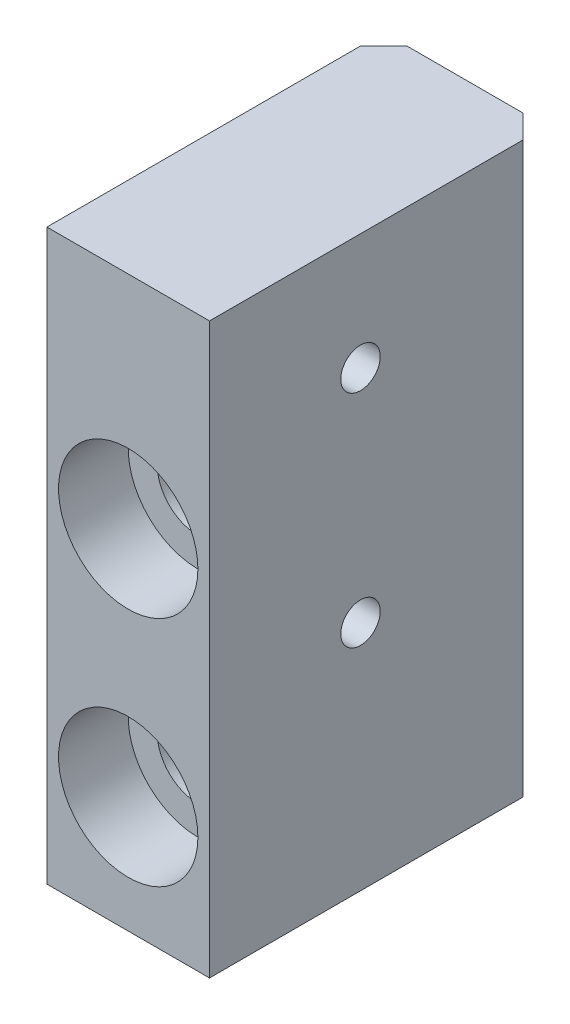
ISO-10303-21;
HEADER;
FILE_DESCRIPTION(('STEP AP214'),'2;1');
FILE_NAME('part.step','',(''),(''),'','','');
FILE_SCHEMA(('AUTOMOTIVE_DESIGN { 1 0 10303 214 1 1 1 1 }'));
ENDSEC;
DATA;
#1=APPLICATION_CONTEXT('core data for automotive mechanical design processes');
#2=APPLICATION_PROTOCOL_DEFINITION('international standard','automotive_design',2000,#1);
#3=PRODUCT_CONTEXT('',#1,'mechanical');
#4=PRODUCT('Part','Part','',(#3));
#5=PRODUCT_RELATED_PRODUCT_CATEGORY('part','',(#4));
#6=PRODUCT_DEFINITION_FORMATION('','',#4);
#7=PRODUCT_DEFINITION_CONTEXT('part definition',#1,'design');
#8=PRODUCT_DEFINITION('design','',#6,#7);
#9=PRODUCT_DEFINITION_SHAPE('','',#8);
#10=(LENGTH_UNIT() NAMED_UNIT(*) SI_UNIT(.MILLI.,.METRE.));
#11=(NAMED_UNIT(*) PLANE_ANGLE_UNIT() SI_UNIT($,.RADIAN.));
#12=(NAMED_UNIT(*) SI_UNIT($,.STERADIAN.) SOLID_ANGLE_UNIT());
#13=UNCERTAINTY_MEASURE_WITH_UNIT(LENGTH_MEASURE(1.E-05),#10,'distance_accuracy_value','');
#14=(GEOMETRIC_REPRESENTATION_CONTEXT(3) GLOBAL_UNCERTAINTY_ASSIGNED_CONTEXT((#13)) GLOBAL_UNIT_ASSIGNED_CONTEXT((#10,
#11,#12)) REPRESENTATION_CONTEXT('',''));
#15=CARTESIAN_POINT('',(0.,0.,0.));
#16=DIRECTION('',(0.,0.,1.));
#17=DIRECTION('',(1.,0.,0.));
#18=AXIS2_PLACEMENT_3D('',#15,#16,#17);
#19=CARTESIAN_POINT('',(3.5,-9.75,-8.));
#20=DIRECTION('',(0.,0.,1.));
#21=DIRECTION('',(1.,0.,0.));
#22=AXIS2_PLACEMENT_3D('',#19,#20,#21);
#23=CYLINDRICAL_SURFACE('',#22,1.75);
#24=CARTESIAN_POINT('',(3.5,-9.75,-8.));
#25=DIRECTION('',(0.,0.,1.));
#26=DIRECTION('',(1.,0.,0.));
#27=AXIS2_PLACEMENT_3D('',#24,#25,#26);
#28=CIRCLE('',#27,1.75);
#29=CARTESIAN_POINT('',(5.25,-9.75,-8.));
#30=VERTEX_POINT('',#29);
#31=EDGE_CURVE('E133',#30,#30,#28,.T.);
#32=ORIENTED_EDGE('',*,*,#31,.F.);
#33=EDGE_LOOP('',(#32));
#34=FACE_BOUND('',#33,.T.);
#35=CARTESIAN_POINT('',(3.5,-9.75,3.5));
#36=DIRECTION('',(0.,0.,1.));
#37=DIRECTION('',(1.,0.,0.));
#38=AXIS2_PLACEMENT_3D('',#35,#36,#37);
#39=CIRCLE('',#38,1.75);
#40=CARTESIAN_POINT('',(5.25,-9.75,3.5));
#41=VERTEX_POINT('',#40);
#42=EDGE_CURVE('E38',#41,#41,#39,.F.);
#43=ORIENTED_EDGE('',*,*,#42,.F.);
#44=EDGE_LOOP('',(#43));
#45=FACE_BOUND('',#44,.T.);
#46=ADVANCED_FACE('F34',(#34,#45),#23,.F.);
#47=CARTESIAN_POINT('',(3.5,0.25,-8.));
#48=DIRECTION('',(0.,0.,1.));
#49=DIRECTION('',(1.,0.,0.));
#50=AXIS2_PLACEMENT_3D('',#47,#48,#49);
#51=CYLINDRICAL_SURFACE('',#50,1.75);
#52=CARTESIAN_POINT('',(3.5,0.25,-8.));
#53=DIRECTION('',(0.,0.,1.));
#54=DIRECTION('',(1.,0.,0.));
#55=AXIS2_PLACEMENT_3D('',#52,#53,#54);
#56=CIRCLE('',#55,1.75);
#57=CARTESIAN_POINT('',(5.25,0.25,-8.));
#58=VERTEX_POINT('',#57);
#59=EDGE_CURVE('E138',#58,#58,#56,.T.);
#60=ORIENTED_EDGE('',*,*,#59,.F.);
#61=EDGE_LOOP('',(#60));
#62=FACE_BOUND('',#61,.T.);
#63=CARTESIAN_POINT('',(3.5,0.25,3.5));
#64=DIRECTION('',(0.,0.,1.));
#65=DIRECTION('',(1.,0.,0.));
#66=AXIS2_PLACEMENT_3D('',#63,#64,#65);
#67=CIRCLE('',#66,1.75);
#68=CARTESIAN_POINT('',(5.25,0.25,3.5));
#69=VERTEX_POINT('',#68);
#70=EDGE_CURVE('E131',#69,#69,#67,.F.);
#71=ORIENTED_EDGE('',*,*,#70,.F.);
#72=EDGE_LOOP('',(#71));
#73=FACE_BOUND('',#72,.T.);
#74=ADVANCED_FACE('F194',(#62,#73),#51,.F.);
#75=CARTESIAN_POINT('',(7.,0.,0.));
#76=DIRECTION('',(1.,0.,0.));
#77=DIRECTION('',(0.,0.,-1.));
#78=AXIS2_PLACEMENT_3D('',#75,#76,#77);
#79=PLANE('',#78);
#80=CARTESIAN_POINT('',(7.,4.75,0.));
#81=DIRECTION('',(1.,0.,0.));
#82=DIRECTION('',(0.,0.,-1.));
#83=AXIS2_PLACEMENT_3D('',#80,#81,#82);
#84=CIRCLE('',#83,0.85);
#85=CARTESIAN_POINT('',(7.,4.75,-0.850000000000002));
#86=VERTEX_POINT('',#85);
#87=EDGE_CURVE('E160',#86,#86,#84,.T.);
#88=ORIENTED_EDGE('',*,*,#87,.F.);
#89=EDGE_LOOP('',(#88));
#90=FACE_BOUND('',#89,.T.);
#91=DIRECTION('',(0.,0.,-1.));
#92=VECTOR('',#91,1.);
#93=CARTESIAN_POINT('',(7.,-14.75,6.5));
#94=LINE('',#93,#92);
#95=CARTESIAN_POINT('',(7.,-14.75,6.5));
#96=VERTEX_POINT('',#95);
#97=CARTESIAN_POINT('',(7.,-14.75,-7.));
#98=VERTEX_POINT('',#97);
#99=EDGE_CURVE('E88',#96,#98,#94,.T.);
#100=ORIENTED_EDGE('',*,*,#99,.T.);
#101=DIRECTION('',(0.,1.,0.));
#102=VECTOR('',#101,1.);
#103=CARTESIAN_POINT('',(7.,9.75,-7.));
#104=LINE('',#103,#102);
#105=CARTESIAN_POINT('',(7.,9.75,-7.));
#106=VERTEX_POINT('',#105);
#107=EDGE_CURVE('E113',#98,#106,#104,.T.);
#108=ORIENTED_EDGE('',*,*,#107,.T.);
#109=DIRECTION('',(0.,0.,1.));
#110=VECTOR('',#109,1.);
#111=CARTESIAN_POINT('',(7.,9.75,6.5));
#112=LINE('',#111,#110);
#113=CARTESIAN_POINT('',(7.,9.75,6.5));
#114=VERTEX_POINT('',#113);
#115=EDGE_CURVE('E98',#106,#114,#112,.T.);
#116=ORIENTED_EDGE('',*,*,#115,.T.);
#117=DIRECTION('',(0.,-1.,0.));
#118=VECTOR('',#117,1.);
#119=CARTESIAN_POINT('',(7.,9.75,6.5));
#120=LINE('',#119,#118);
#121=EDGE_CURVE('E99',#114,#96,#120,.T.);
#122=ORIENTED_EDGE('',*,*,#121,.T.);
#123=EDGE_LOOP('',(#100,#108,#116,#122));
#124=FACE_BOUND('',#123,.T.);
#125=CARTESIAN_POINT('',(7.,-4.75,0.));
#126=DIRECTION('',(1.,0.,0.));
#127=DIRECTION('',(0.,0.,-1.));
#128=AXIS2_PLACEMENT_3D('',#125,#126,#127);
#129=CIRCLE('',#128,0.85);
#130=CARTESIAN_POINT('',(7.,-4.75,-0.85));
#131=VERTEX_POINT('',#130);
#132=EDGE_CURVE('E154',#131,#131,#129,.T.);
#133=ORIENTED_EDGE('',*,*,#132,.F.);
#134=EDGE_LOOP('',(#133));
#135=FACE_BOUND('',#134,.T.);
#136=ADVANCED_FACE('F102',(#90,#124,#135),#79,.T.);
#137=CARTESIAN_POINT('',(0.,0.,0.));
#138=DIRECTION('',(1.,0.,0.));
#139=DIRECTION('',(0.,0.,-1.));
#140=AXIS2_PLACEMENT_3D('',#137,#138,#139);
#141=PLANE('',#140);
#142=CARTESIAN_POINT('',(0.,4.75,0.));
#143=DIRECTION('',(1.,0.,0.));
#144=DIRECTION('',(0.,0.,-1.));
#145=AXIS2_PLACEMENT_3D('',#142,#143,#144);
#146=CIRCLE('',#145,0.85);
#147=CARTESIAN_POINT('',(0.,4.75,-0.850000000000002));
#148=VERTEX_POINT('',#147);
#149=EDGE_CURVE('E157',#148,#148,#146,.T.);
#150=ORIENTED_EDGE('',*,*,#149,.T.);
#151=EDGE_LOOP('',(#150));
#152=FACE_BOUND('',#151,.T.);
#153=DIRECTION('',(0.,0.,1.));
#154=VECTOR('',#153,1.);
#155=CARTESIAN_POINT('',(0.,9.75,6.5));
#156=LINE('',#155,#154);
#157=CARTESIAN_POINT('',(0.,9.75,-6.99999999999999));
#158=VERTEX_POINT('',#157);
#159=CARTESIAN_POINT('',(0.,9.75,6.5));
#160=VERTEX_POINT('',#159);
#161=EDGE_CURVE('E108',#158,#160,#156,.T.);
#162=ORIENTED_EDGE('',*,*,#161,.F.);
#163=DIRECTION('',(0.,-1.,0.));
#164=VECTOR('',#163,1.);
#165=CARTESIAN_POINT('',(0.,0.,-7.));
#166=LINE('',#165,#164);
#167=CARTESIAN_POINT('',(0.,-14.75,-7.));
#168=VERTEX_POINT('',#167);
#169=EDGE_CURVE('E11',#158,#168,#166,.T.);
#170=ORIENTED_EDGE('',*,*,#169,.T.);
#171=DIRECTION('',(0.,0.,-1.));
#172=VECTOR('',#171,1.);
#173=CARTESIAN_POINT('',(0.,-14.75,6.5));
#174=LINE('',#173,#172);
#175=CARTESIAN_POINT('',(0.,-14.75,6.5));
#176=VERTEX_POINT('',#175);
#177=EDGE_CURVE('E168',#176,#168,#174,.T.);
#178=ORIENTED_EDGE('',*,*,#177,.F.);
#179=DIRECTION('',(0.,-1.,0.));
#180=VECTOR('',#179,1.);
#181=CARTESIAN_POINT('',(0.,9.75,6.5));
#182=LINE('',#181,#180);
#183=EDGE_CURVE('E112',#160,#176,#182,.T.);
#184=ORIENTED_EDGE('',*,*,#183,.F.);
#185=EDGE_LOOP('',(#162,#170,#178,#184));
#186=FACE_BOUND('',#185,.T.);
#187=CARTESIAN_POINT('',(0.,-4.75,0.));
#188=DIRECTION('',(1.,0.,0.));
#189=DIRECTION('',(0.,0.,-1.));
#190=AXIS2_PLACEMENT_3D('',#187,#188,#189);
#191=CIRCLE('',#190,0.85);
#192=CARTESIAN_POINT('',(0.,-4.75,-0.85));
#193=VERTEX_POINT('',#192);
#194=EDGE_CURVE('E153',#193,#193,#191,.T.);
#195=ORIENTED_EDGE('',*,*,#194,.T.);
#196=EDGE_LOOP('',(#195));
#197=FACE_BOUND('',#196,.T.);
#198=ADVANCED_FACE('F181',(#152,#186,#197),#141,.F.);
#199=CARTESIAN_POINT('',(7.,9.75,6.5));
#200=DIRECTION('',(0.,0.,-1.));
#201=DIRECTION('',(0.,1.,0.));
#202=AXIS2_PLACEMENT_3D('',#199,#200,#201);
#203=PLANE('',#202);
#204=CARTESIAN_POINT('',(3.5,-9.75,6.5));
#205=DIRECTION('',(0.,0.,1.));
#206=DIRECTION('',(1.,0.,0.));
#207=AXIS2_PLACEMENT_3D('',#204,#205,#206);
#208=CIRCLE('',#207,3.);
#209=CARTESIAN_POINT('',(6.5,-9.75,6.5));
#210=VERTEX_POINT('',#209);
#211=EDGE_CURVE('E148',#210,#210,#208,.T.);
#212=ORIENTED_EDGE('',*,*,#211,.F.);
#213=EDGE_LOOP('',(#212));
#214=FACE_BOUND('',#213,.T.);
#215=CARTESIAN_POINT('',(3.5,0.25,6.5));
#216=DIRECTION('',(0.,0.,1.));
#217=DIRECTION('',(1.,0.,0.));
#218=AXIS2_PLACEMENT_3D('',#215,#216,#217);
#219=CIRCLE('',#218,3.);
#220=CARTESIAN_POINT('',(6.5,0.25,6.5));
#221=VERTEX_POINT('',#220);
#222=EDGE_CURVE('E141',#221,#221,#219,.T.);
#223=ORIENTED_EDGE('',*,*,#222,.F.);
#224=EDGE_LOOP('',(#223));
#225=FACE_BOUND('',#224,.T.);
#226=ORIENTED_EDGE('',*,*,#183,.T.);
#227=DIRECTION('',(-1.,0.,0.));
#228=VECTOR('',#227,1.);
#229=CARTESIAN_POINT('',(7.,-14.75,6.5));
#230=LINE('',#229,#228);
#231=EDGE_CURVE('E92',#96,#176,#230,.T.);
#232=ORIENTED_EDGE('',*,*,#231,.F.);
#233=ORIENTED_EDGE('',*,*,#121,.F.);
#234=DIRECTION('',(-1.,0.,0.));
#235=VECTOR('',#234,1.);
#236=CARTESIAN_POINT('',(7.,9.75,6.5));
#237=LINE('',#236,#235);
#238=EDGE_CURVE('E166',#114,#160,#237,.T.);
#239=ORIENTED_EDGE('',*,*,#238,.T.);
#240=EDGE_LOOP('',(#226,#232,#233,#239));
#241=FACE_BOUND('',#240,.T.);
#242=ADVANCED_FACE('F110',(#214,#225,#241),#203,.F.);
#243=CARTESIAN_POINT('',(7.,-14.75,6.5));
#244=DIRECTION('',(0.,1.,0.));
#245=DIRECTION('',(0.,0.,1.));
#246=AXIS2_PLACEMENT_3D('',#243,#244,#245);
#247=PLANE('',#246);
#248=DIRECTION('',(-1.,0.,0.));
#249=VECTOR('',#248,1.);
#250=CARTESIAN_POINT('',(7.,-14.75,-8.));
#251=LINE('',#250,#249);
#252=CARTESIAN_POINT('',(6.,-14.75,-8.));
#253=VERTEX_POINT('',#252);
#254=CARTESIAN_POINT('',(1.,-14.75,-8.));
#255=VERTEX_POINT('',#254);
#256=EDGE_CURVE('E114',#253,#255,#251,.T.);
#257=ORIENTED_EDGE('',*,*,#256,.F.);
#258=DIRECTION('',(0.707106781186549,0.,0.707106781186546));
#259=VECTOR('',#258,1.);
#260=CARTESIAN_POINT('',(7.,-14.75,-7.));
#261=LINE('',#260,#259);
#262=EDGE_CURVE('E43',#253,#98,#261,.T.);
#263=ORIENTED_EDGE('',*,*,#262,.T.);
#264=ORIENTED_EDGE('',*,*,#99,.F.);
#265=ORIENTED_EDGE('',*,*,#231,.T.);
#266=ORIENTED_EDGE('',*,*,#177,.T.);
#267=DIRECTION('',(-0.707106781186546,0.,0.707106781186549));
#268=VECTOR('',#267,1.);
#269=CARTESIAN_POINT('',(1.,-14.75,-8.));
#270=LINE('',#269,#268);
#271=EDGE_CURVE('E56',#168,#255,#270,.F.);
#272=ORIENTED_EDGE('',*,*,#271,.T.);
#273=EDGE_LOOP('',(#257,#263,#264,#265,#266,#272));
#274=FACE_BOUND('',#273,.T.);
#275=ADVANCED_FACE('F90',(#274),#247,.F.);
#276=CARTESIAN_POINT('',(7.,9.75,-8.));
#277=DIRECTION('',(0.,0.,1.));
#278=DIRECTION('',(0.,-1.,0.));
#279=AXIS2_PLACEMENT_3D('',#276,#277,#278);
#280=PLANE('',#279);
#281=ORIENTED_EDGE('',*,*,#31,.T.);
#282=EDGE_LOOP('',(#281));
#283=FACE_BOUND('',#282,.T.);
#284=ORIENTED_EDGE('',*,*,#59,.T.);
#285=EDGE_LOOP('',(#284));
#286=FACE_BOUND('',#285,.T.);
#287=DIRECTION('',(-1.,0.,0.));
#288=VECTOR('',#287,1.);
#289=CARTESIAN_POINT('',(7.,9.75,-8.));
#290=LINE('',#289,#288);
#291=CARTESIAN_POINT('',(6.,9.75,-8.));
#292=VERTEX_POINT('',#291);
#293=CARTESIAN_POINT('',(1.,9.75,-8.));
#294=VERTEX_POINT('',#293);
#295=EDGE_CURVE('E118',#292,#294,#290,.T.);
#296=ORIENTED_EDGE('',*,*,#295,.F.);
#297=DIRECTION('',(0.,-1.,0.));
#298=VECTOR('',#297,1.);
#299=CARTESIAN_POINT('',(6.,-14.75,-8.));
#300=LINE('',#299,#298);
#301=EDGE_CURVE('E128',#292,#253,#300,.T.);
#302=ORIENTED_EDGE('',*,*,#301,.T.);
#303=ORIENTED_EDGE('',*,*,#256,.T.);
#304=DIRECTION('',(0.,1.,0.));
#305=VECTOR('',#304,1.);
#306=CARTESIAN_POINT('',(1.,9.75,-8.));
#307=LINE('',#306,#305);
#308=EDGE_CURVE('E125',#255,#294,#307,.T.);
#309=ORIENTED_EDGE('',*,*,#308,.T.);
#310=EDGE_LOOP('',(#296,#302,#303,#309));
#311=FACE_BOUND('',#310,.T.);
#312=ADVANCED_FACE('F177',(#283,#286,#311),#280,.F.);
#313=CARTESIAN_POINT('',(7.,9.75,6.5));
#314=DIRECTION('',(0.,-1.,0.));
#315=DIRECTION('',(0.,0.,-1.));
#316=AXIS2_PLACEMENT_3D('',#313,#314,#315);
#317=PLANE('',#316);
#318=ORIENTED_EDGE('',*,*,#115,.F.);
#319=DIRECTION('',(-0.707106781186549,0.,-0.707106781186546));
#320=VECTOR('',#319,1.);
#321=CARTESIAN_POINT('',(7.,9.75,-7.));
#322=LINE('',#321,#320);
#323=EDGE_CURVE('E123',#106,#292,#322,.T.);
#324=ORIENTED_EDGE('',*,*,#323,.T.);
#325=ORIENTED_EDGE('',*,*,#295,.T.);
#326=DIRECTION('',(0.707106781186546,0.,-0.707106781186549));
#327=VECTOR('',#326,1.);
#328=CARTESIAN_POINT('',(1.,9.75,-8.));
#329=LINE('',#328,#327);
#330=EDGE_CURVE('E116',#294,#158,#329,.F.);
#331=ORIENTED_EDGE('',*,*,#330,.T.);
#332=ORIENTED_EDGE('',*,*,#161,.T.);
#333=ORIENTED_EDGE('',*,*,#238,.F.);
#334=EDGE_LOOP('',(#318,#324,#325,#331,#332,#333));
#335=FACE_BOUND('',#334,.T.);
#336=ADVANCED_FACE('F174',(#335),#317,.F.);
#337=CARTESIAN_POINT('',(7.,4.75,0.));
#338=DIRECTION('',(-1.,0.,0.));
#339=DIRECTION('',(0.,0.,1.));
#340=AXIS2_PLACEMENT_3D('',#337,#338,#339);
#341=CYLINDRICAL_SURFACE('',#340,0.85);
#342=ORIENTED_EDGE('',*,*,#87,.T.);
#343=EDGE_LOOP('',(#342));
#344=FACE_BOUND('',#343,.T.);
#345=ORIENTED_EDGE('',*,*,#149,.F.);
#346=EDGE_LOOP('',(#345));
#347=FACE_BOUND('',#346,.T.);
#348=ADVANCED_FACE('F208',(#344,#347),#341,.F.);
#349=CARTESIAN_POINT('',(7.,-4.75,0.));
#350=DIRECTION('',(-1.,0.,0.));
#351=DIRECTION('',(0.,0.,1.));
#352=AXIS2_PLACEMENT_3D('',#349,#350,#351);
#353=CYLINDRICAL_SURFACE('',#352,0.85);
#354=ORIENTED_EDGE('',*,*,#132,.T.);
#355=EDGE_LOOP('',(#354));
#356=FACE_BOUND('',#355,.T.);
#357=ORIENTED_EDGE('',*,*,#194,.F.);
#358=EDGE_LOOP('',(#357));
#359=FACE_BOUND('',#358,.T.);
#360=ADVANCED_FACE('F192',(#356,#359),#353,.F.);
#361=CARTESIAN_POINT('',(7.,0.,-7.));
#362=DIRECTION('',(0.707106781186546,0.,-0.707106781186549));
#363=DIRECTION('',(0.,-1.,0.));
#364=AXIS2_PLACEMENT_3D('',#361,#362,#363);
#365=PLANE('',#364);
#366=ORIENTED_EDGE('',*,*,#262,.F.);
#367=ORIENTED_EDGE('',*,*,#301,.F.);
#368=ORIENTED_EDGE('',*,*,#323,.F.);
#369=ORIENTED_EDGE('',*,*,#107,.F.);
#370=EDGE_LOOP('',(#366,#367,#368,#369));
#371=FACE_BOUND('',#370,.T.);
#372=ADVANCED_FACE('F180',(#371),#365,.T.);
#373=CARTESIAN_POINT('',(1.,9.75,-8.));
#374=DIRECTION('',(0.707106781186549,0.,0.707106781186546));
#375=DIRECTION('',(0.,1.,0.));
#376=AXIS2_PLACEMENT_3D('',#373,#374,#375);
#377=PLANE('',#376);
#378=ORIENTED_EDGE('',*,*,#271,.F.);
#379=ORIENTED_EDGE('',*,*,#169,.F.);
#380=ORIENTED_EDGE('',*,*,#330,.F.);
#381=ORIENTED_EDGE('',*,*,#308,.F.);
#382=EDGE_LOOP('',(#378,#379,#380,#381));
#383=FACE_BOUND('',#382,.T.);
#384=ADVANCED_FACE('F36',(#383),#377,.F.);
#385=CARTESIAN_POINT('',(3.5,0.25,3.5));
#386=DIRECTION('',(0.,0.,1.));
#387=DIRECTION('',(1.,0.,0.));
#388=AXIS2_PLACEMENT_3D('',#385,#386,#387);
#389=PLANE('',#388);
#390=CARTESIAN_POINT('',(3.5,0.25,3.5));
#391=DIRECTION('',(0.,0.,1.));
#392=DIRECTION('',(1.,0.,0.));
#393=AXIS2_PLACEMENT_3D('',#390,#391,#392);
#394=CIRCLE('',#393,3.);
#395=CARTESIAN_POINT('',(6.5,0.25,3.5));
#396=VERTEX_POINT('',#395);
#397=EDGE_CURVE('E134',#396,#396,#394,.T.);
#398=ORIENTED_EDGE('',*,*,#397,.T.);
#399=EDGE_LOOP('',(#398));
#400=FACE_BOUND('',#399,.T.);
#401=ORIENTED_EDGE('',*,*,#70,.T.);
#402=EDGE_LOOP('',(#401));
#403=FACE_BOUND('',#402,.T.);
#404=ADVANCED_FACE('F185',(#400,#403),#389,.T.);
#405=CARTESIAN_POINT('',(3.5,0.25,3.5));
#406=DIRECTION('',(0.,0.,1.));
#407=DIRECTION('',(1.,0.,0.));
#408=AXIS2_PLACEMENT_3D('',#405,#406,#407);
#409=CYLINDRICAL_SURFACE('',#408,3.);
#410=ORIENTED_EDGE('',*,*,#397,.F.);
#411=EDGE_LOOP('',(#410));
#412=FACE_BOUND('',#411,.T.);
#413=ORIENTED_EDGE('',*,*,#222,.T.);
#414=EDGE_LOOP('',(#413));
#415=FACE_BOUND('',#414,.T.);
#416=ADVANCED_FACE('F190',(#412,#415),#409,.F.);
#417=CARTESIAN_POINT('',(3.5,-9.75,3.5));
#418=DIRECTION('',(0.,0.,1.));
#419=DIRECTION('',(1.,0.,0.));
#420=AXIS2_PLACEMENT_3D('',#417,#418,#419);
#421=PLANE('',#420);
#422=CARTESIAN_POINT('',(3.5,-9.75,3.5));
#423=DIRECTION('',(0.,0.,1.));
#424=DIRECTION('',(1.,0.,0.));
#425=AXIS2_PLACEMENT_3D('',#422,#423,#424);
#426=CIRCLE('',#425,3.);
#427=CARTESIAN_POINT('',(6.5,-9.75,3.5));
#428=VERTEX_POINT('',#427);
#429=EDGE_CURVE('E252',#428,#428,#426,.T.);
#430=ORIENTED_EDGE('',*,*,#429,.T.);
#431=EDGE_LOOP('',(#430));
#432=FACE_BOUND('',#431,.T.);
#433=ORIENTED_EDGE('',*,*,#42,.T.);
#434=EDGE_LOOP('',(#433));
#435=FACE_BOUND('',#434,.T.);
#436=ADVANCED_FACE('F236',(#432,#435),#421,.T.);
#437=CARTESIAN_POINT('',(3.5,-9.75,3.5));
#438=DIRECTION('',(0.,0.,1.));
#439=DIRECTION('',(1.,0.,0.));
#440=AXIS2_PLACEMENT_3D('',#437,#438,#439);
#441=CYLINDRICAL_SURFACE('',#440,3.);
#442=ORIENTED_EDGE('',*,*,#429,.F.);
#443=EDGE_LOOP('',(#442));
#444=FACE_BOUND('',#443,.T.);
#445=ORIENTED_EDGE('',*,*,#211,.T.);
#446=EDGE_LOOP('',(#445));
#447=FACE_BOUND('',#446,.T.);
#448=ADVANCED_FACE('F241',(#444,#447),#441,.F.);
#449=CLOSED_SHELL('',(#46,#74,#136,#198,#242,#275,#312,#336,#348,#360,#372,#384,#404,#416,#436,#448));
#450=MANIFOLD_SOLID_BREP('B2',#449);
#451=ADVANCED_BREP_SHAPE_REPRESENTATION('',(#18,#450),#14);
#452=SHAPE_DEFINITION_REPRESENTATION(#9,#451);
ENDSEC;
END-ISO-10303-21;
